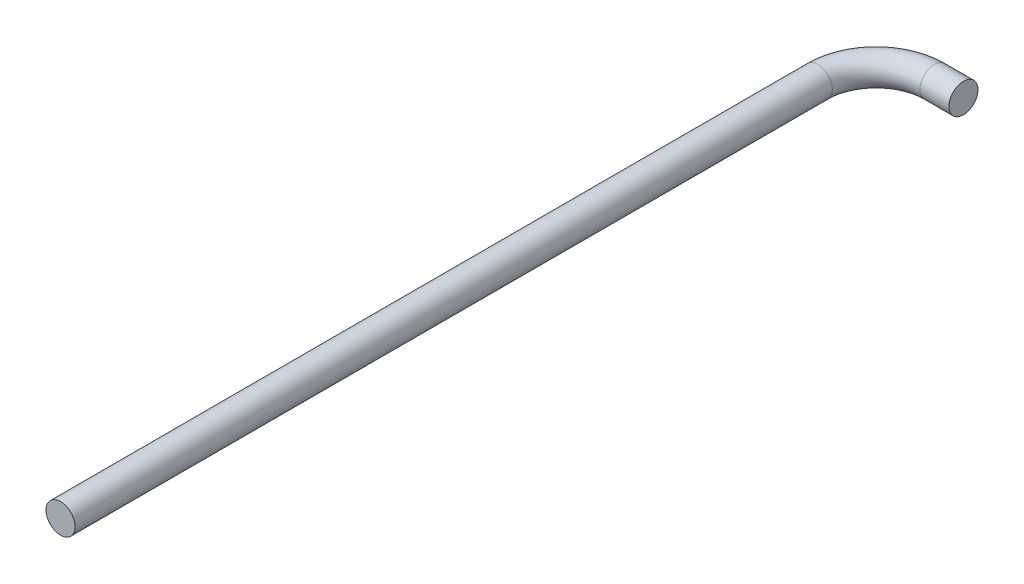
ISO-10303-21;
HEADER;
FILE_DESCRIPTION(('STEP AP214'),'2;1');
FILE_NAME('part.step','',(''),(''),'','','');
FILE_SCHEMA(('AUTOMOTIVE_DESIGN { 1 0 10303 214 1 1 1 1 }'));
ENDSEC;
DATA;
#1=APPLICATION_CONTEXT('core data for automotive mechanical design processes');
#2=APPLICATION_PROTOCOL_DEFINITION('international standard','automotive_design',2000,#1);
#3=PRODUCT_CONTEXT('',#1,'mechanical');
#4=PRODUCT('Part','Part','',(#3));
#5=PRODUCT_RELATED_PRODUCT_CATEGORY('part','',(#4));
#6=PRODUCT_DEFINITION_FORMATION('','',#4);
#7=PRODUCT_DEFINITION_CONTEXT('part definition',#1,'design');
#8=PRODUCT_DEFINITION('design','',#6,#7);
#9=PRODUCT_DEFINITION_SHAPE('','',#8);
#10=(LENGTH_UNIT() NAMED_UNIT(*) SI_UNIT(.MILLI.,.METRE.));
#11=(NAMED_UNIT(*) PLANE_ANGLE_UNIT() SI_UNIT($,.RADIAN.));
#12=(NAMED_UNIT(*) SI_UNIT($,.STERADIAN.) SOLID_ANGLE_UNIT());
#13=UNCERTAINTY_MEASURE_WITH_UNIT(LENGTH_MEASURE(1.E-05),#10,'distance_accuracy_value','');
#14=(GEOMETRIC_REPRESENTATION_CONTEXT(3) GLOBAL_UNCERTAINTY_ASSIGNED_CONTEXT((#13)) GLOBAL_UNIT_ASSIGNED_CONTEXT((#10,
#11,#12)) REPRESENTATION_CONTEXT('',''));
#15=CARTESIAN_POINT('',(0.,0.,0.));
#16=DIRECTION('',(0.,0.,1.));
#17=DIRECTION('',(1.,0.,0.));
#18=AXIS2_PLACEMENT_3D('',#15,#16,#17);
#19=CARTESIAN_POINT('',(0.,0.,0.));
#20=DIRECTION('',(0.,1.,0.));
#21=DIRECTION('',(0.,0.,1.));
#22=AXIS2_PLACEMENT_3D('',#19,#20,#21);
#23=TOROIDAL_SURFACE('',#22,10.,2.5);
#24=CARTESIAN_POINT('',(0.,0.,-10.));
#25=DIRECTION('',(1.,0.,0.));
#26=DIRECTION('',(0.,0.,-1.));
#27=AXIS2_PLACEMENT_3D('',#24,#25,#26);
#28=CIRCLE('',#27,2.5);
#29=CARTESIAN_POINT('',(0.,0.,-12.5));
#30=VERTEX_POINT('',#29);
#31=EDGE_CURVE('E46',#30,#30,#28,.T.);
#32=CARTESIAN_POINT('',(-10.,0.,0.));
#33=DIRECTION('',(0.,0.,1.));
#34=DIRECTION('',(1.,0.,0.));
#35=AXIS2_PLACEMENT_3D('',#32,#33,#34);
#36=CIRCLE('',#35,2.5);
#37=CARTESIAN_POINT('',(-12.5,0.,0.));
#38=VERTEX_POINT('',#37);
#39=EDGE_CURVE('E10',#38,#38,#36,.T.);
#40=CARTESIAN_POINT('',(0.,0.,0.));
#41=DIRECTION('',(0.,1.,0.));
#42=DIRECTION('',(0.,0.,1.));
#43=AXIS2_PLACEMENT_3D('',#40,#41,#42);
#44=CIRCLE('',#43,12.5);
#45=EDGE_CURVE('',#30,#38,#44,.T.);
#46=ORIENTED_EDGE('',*,*,#31,.F.);
#47=ORIENTED_EDGE('',*,*,#39,.F.);
#48=ORIENTED_EDGE('',*,*,#45,.T.);
#49=ORIENTED_EDGE('',*,*,#45,.F.);
#50=EDGE_LOOP('',(#46,#48,#47,#49));
#51=FACE_BOUND('',#50,.T.);
#52=ADVANCED_FACE('F32',(#51),#23,.T.);
#53=CARTESIAN_POINT('',(-10.,0.,130.));
#54=DIRECTION('',(0.,0.,-1.));
#55=DIRECTION('',(-1.,0.,0.));
#56=AXIS2_PLACEMENT_3D('',#53,#54,#55);
#57=CYLINDRICAL_SURFACE('',#56,2.5);
#58=CARTESIAN_POINT('',(-10.,0.,130.));
#59=DIRECTION('',(0.,0.,1.));
#60=DIRECTION('',(1.,0.,0.));
#61=AXIS2_PLACEMENT_3D('',#58,#59,#60);
#62=CIRCLE('',#61,2.5);
#63=CARTESIAN_POINT('',(-7.5,0.,130.));
#64=VERTEX_POINT('',#63);
#65=EDGE_CURVE('E38',#64,#64,#62,.T.);
#66=ORIENTED_EDGE('',*,*,#65,.F.);
#67=EDGE_LOOP('',(#66));
#68=FACE_BOUND('',#67,.T.);
#69=ORIENTED_EDGE('',*,*,#39,.T.);
#70=EDGE_LOOP('',(#69));
#71=FACE_BOUND('',#70,.T.);
#72=ADVANCED_FACE('F56',(#68,#71),#57,.T.);
#73=CARTESIAN_POINT('',(-10.,0.,130.));
#74=DIRECTION('',(0.,0.,1.));
#75=DIRECTION('',(1.,0.,0.));
#76=AXIS2_PLACEMENT_3D('',#73,#74,#75);
#77=PLANE('',#76);
#78=ORIENTED_EDGE('',*,*,#65,.T.);
#79=EDGE_LOOP('',(#78));
#80=FACE_BOUND('',#79,.T.);
#81=ADVANCED_FACE('F60',(#80),#77,.T.);
#82=CARTESIAN_POINT('',(5.00000000000003,0.,-9.99999999999998));
#83=DIRECTION('',(-1.,0.,0.));
#84=DIRECTION('',(0.,0.,1.));
#85=AXIS2_PLACEMENT_3D('',#82,#83,#84);
#86=CYLINDRICAL_SURFACE('',#85,2.5);
#87=CARTESIAN_POINT('',(5.00000000000003,0.,-9.99999999999998));
#88=DIRECTION('',(1.,0.,0.));
#89=DIRECTION('',(0.,0.,-1.));
#90=AXIS2_PLACEMENT_3D('',#87,#88,#89);
#91=CIRCLE('',#90,2.5);
#92=CARTESIAN_POINT('',(5.00000000000004,0.,-12.5));
#93=VERTEX_POINT('',#92);
#94=EDGE_CURVE('E42',#93,#93,#91,.T.);
#95=ORIENTED_EDGE('',*,*,#94,.F.);
#96=EDGE_LOOP('',(#95));
#97=FACE_BOUND('',#96,.T.);
#98=ORIENTED_EDGE('',*,*,#31,.T.);
#99=EDGE_LOOP('',(#98));
#100=FACE_BOUND('',#99,.T.);
#101=ADVANCED_FACE('F52',(#97,#100),#86,.T.);
#102=CARTESIAN_POINT('',(5.00000000000003,0.,-9.99999999999998));
#103=DIRECTION('',(1.,0.,0.));
#104=DIRECTION('',(0.,0.,-1.));
#105=AXIS2_PLACEMENT_3D('',#102,#103,#104);
#106=PLANE('',#105);
#107=ORIENTED_EDGE('',*,*,#94,.T.);
#108=EDGE_LOOP('',(#107));
#109=FACE_BOUND('',#108,.T.);
#110=ADVANCED_FACE('F69',(#109),#106,.T.);
#111=CLOSED_SHELL('',(#52,#72,#81,#101,#110));
#112=MANIFOLD_SOLID_BREP('B2',#111);
#113=ADVANCED_BREP_SHAPE_REPRESENTATION('',(#18,#112),#14);
#114=SHAPE_DEFINITION_REPRESENTATION(#9,#113);
ENDSEC;
END-ISO-10303-21;
